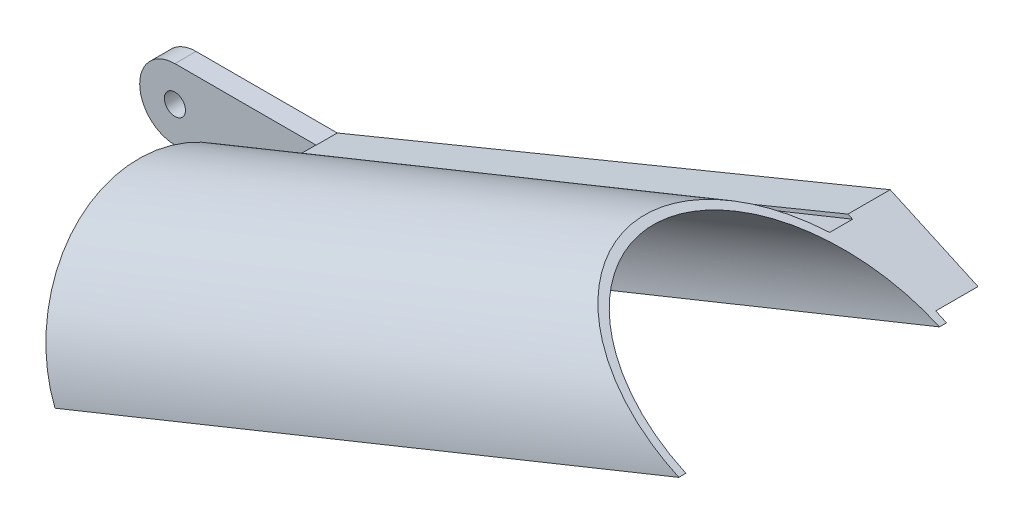
ISO-10303-21;
HEADER;
FILE_DESCRIPTION(('STEP AP214'),'2;1');
FILE_NAME('part.step','',(''),(''),'','','');
FILE_SCHEMA(('AUTOMOTIVE_DESIGN { 1 0 10303 214 1 1 1 1 }'));
ENDSEC;
DATA;
#1=APPLICATION_CONTEXT('core data for automotive mechanical design processes');
#2=APPLICATION_PROTOCOL_DEFINITION('international standard','automotive_design',2000,#1);
#3=PRODUCT_CONTEXT('',#1,'mechanical');
#4=PRODUCT('Part','Part','',(#3));
#5=PRODUCT_RELATED_PRODUCT_CATEGORY('part','',(#4));
#6=PRODUCT_DEFINITION_FORMATION('','',#4);
#7=PRODUCT_DEFINITION_CONTEXT('part definition',#1,'design');
#8=PRODUCT_DEFINITION('design','',#6,#7);
#9=PRODUCT_DEFINITION_SHAPE('','',#8);
#10=(LENGTH_UNIT() NAMED_UNIT(*) SI_UNIT(.MILLI.,.METRE.));
#11=(NAMED_UNIT(*) PLANE_ANGLE_UNIT() SI_UNIT($,.RADIAN.));
#12=(NAMED_UNIT(*) SI_UNIT($,.STERADIAN.) SOLID_ANGLE_UNIT());
#13=UNCERTAINTY_MEASURE_WITH_UNIT(LENGTH_MEASURE(1.E-05),#10,'distance_accuracy_value','');
#14=(GEOMETRIC_REPRESENTATION_CONTEXT(3) GLOBAL_UNCERTAINTY_ASSIGNED_CONTEXT((#13)) GLOBAL_UNIT_ASSIGNED_CONTEXT((#10,
#11,#12)) REPRESENTATION_CONTEXT('',''));
#15=CARTESIAN_POINT('',(0.,0.,0.));
#16=DIRECTION('',(0.,0.,1.));
#17=DIRECTION('',(1.,0.,0.));
#18=AXIS2_PLACEMENT_3D('',#15,#16,#17);
#19=CARTESIAN_POINT('',(4.9396925444234,-12.0143404155981,3.));
#20=DIRECTION('',(0.380263412733207,-0.924878228166549,0.));
#21=DIRECTION('',(0.924878228166549,0.380263412733207,0.));
#22=AXIS2_PLACEMENT_3D('',#19,#20,#21);
#23=PLANE('',#22);
#24=DIRECTION('',(-0.924878228166549,-0.380263412733207,0.));
#25=VECTOR('',#24,1.);
#26=CARTESIAN_POINT('',(4.9396925444234,-12.0143404155981,0.));
#27=LINE('',#26,#25);
#28=CARTESIAN_POINT('',(111.008388468843,31.595772859895,0.));
#29=VERTEX_POINT('',#28);
#30=CARTESIAN_POINT('',(22.,-5.,0.));
#31=VERTEX_POINT('',#30);
#32=EDGE_CURVE('E269',#29,#31,#27,.T.);
#33=ORIENTED_EDGE('',*,*,#32,.F.);
#34=DIRECTION('',(0.,0.,1.));
#35=VECTOR('',#34,1.);
#36=CARTESIAN_POINT('',(111.008388468843,31.595772859895,-70.0584015433783));
#37=LINE('',#36,#35);
#38=CARTESIAN_POINT('',(111.008388468843,31.595772859895,6.));
#39=VERTEX_POINT('',#38);
#40=EDGE_CURVE('E236',#29,#39,#37,.T.);
#41=ORIENTED_EDGE('',*,*,#40,.T.);
#42=DIRECTION('',(0.924878228166549,0.380263412733207,0.));
#43=VECTOR('',#42,1.);
#44=CARTESIAN_POINT('',(111.008388468843,31.595772859895,6.));
#45=LINE('',#44,#43);
#46=CARTESIAN_POINT('',(23.732077121253,-4.28785699869866,6.));
#47=VERTEX_POINT('',#46);
#48=EDGE_CURVE('E219',#47,#39,#45,.T.);
#49=ORIENTED_EDGE('',*,*,#48,.F.);
#50=DIRECTION('',(0.,0.,-1.));
#51=VECTOR('',#50,1.);
#52=CARTESIAN_POINT('',(23.732077121253,-4.28785699869866,6.));
#53=LINE('',#52,#51);
#54=CARTESIAN_POINT('',(23.732077121253,-4.28785699869868,3.));
#55=VERTEX_POINT('',#54);
#56=EDGE_CURVE('E221',#47,#55,#53,.T.);
#57=ORIENTED_EDGE('',*,*,#56,.T.);
#58=DIRECTION('',(-0.924878228166549,-0.380263412733207,0.));
#59=VECTOR('',#58,1.);
#60=CARTESIAN_POINT('',(4.9396925444234,-12.0143404155981,3.));
#61=LINE('',#60,#59);
#62=CARTESIAN_POINT('',(22.,-5.,3.));
#63=VERTEX_POINT('',#62);
#64=EDGE_CURVE('E252',#55,#63,#61,.T.);
#65=ORIENTED_EDGE('',*,*,#64,.T.);
#66=DIRECTION('',(0.,0.,-1.));
#67=VECTOR('',#66,1.);
#68=CARTESIAN_POINT('',(22.,-5.,3.));
#69=LINE('',#68,#67);
#70=EDGE_CURVE('E263',#63,#31,#69,.T.);
#71=ORIENTED_EDGE('',*,*,#70,.T.);
#72=EDGE_LOOP('',(#33,#41,#49,#57,#65,#71));
#73=FACE_BOUND('',#72,.T.);
#74=ADVANCED_FACE('F45',(#73),#23,.T.);
#75=CARTESIAN_POINT('',(1.14074851739701,-2.77453321099285,3.));
#76=DIRECTION('',(-0.380263412733207,0.924878228166549,0.));
#77=DIRECTION('',(-0.924878228166549,-0.380263412733207,0.));
#78=AXIS2_PLACEMENT_3D('',#75,#76,#77);
#79=PLANE('',#78);
#80=DIRECTION('',(0.924878228166549,0.380263412733207,0.));
#81=VECTOR('',#80,1.);
#82=CARTESIAN_POINT('',(1.14074851739701,-2.77453321099285,0.));
#83=LINE('',#82,#81);
#84=CARTESIAN_POINT('',(20.05,5.,0.));
#85=VERTEX_POINT('',#84);
#86=CARTESIAN_POINT('',(98.5445869727126,37.2730264528967,0.));
#87=VERTEX_POINT('',#86);
#88=EDGE_CURVE('E272',#85,#87,#83,.T.);
#89=ORIENTED_EDGE('',*,*,#88,.F.);
#90=DIRECTION('',(0.,0.,-1.));
#91=VECTOR('',#90,1.);
#92=CARTESIAN_POINT('',(20.05,5.,3.));
#93=LINE('',#92,#91);
#94=CARTESIAN_POINT('',(20.05,5.,3.));
#95=VERTEX_POINT('',#94);
#96=EDGE_CURVE('E49',#95,#85,#93,.T.);
#97=ORIENTED_EDGE('',*,*,#96,.F.);
#98=DIRECTION('',(-0.924878228166549,-0.380263412733207,0.));
#99=VECTOR('',#98,1.);
#100=CARTESIAN_POINT('',(98.5445869727126,37.2730264528967,3.));
#101=LINE('',#100,#99);
#102=CARTESIAN_POINT('',(19.9901871082395,4.97540794706412,3.));
#103=VERTEX_POINT('',#102);
#104=EDGE_CURVE('E11',#95,#103,#101,.T.);
#105=ORIENTED_EDGE('',*,*,#104,.T.);
#106=DIRECTION('',(0.,0.,-1.));
#107=VECTOR('',#106,1.);
#108=CARTESIAN_POINT('',(19.9901871082395,4.97540794706412,6.));
#109=LINE('',#108,#107);
#110=CARTESIAN_POINT('',(19.9901871082395,4.97540794706413,6.));
#111=VERTEX_POINT('',#110);
#112=EDGE_CURVE('E233',#111,#103,#109,.T.);
#113=ORIENTED_EDGE('',*,*,#112,.F.);
#114=DIRECTION('',(-0.924878228166549,-0.380263412733207,0.));
#115=VECTOR('',#114,1.);
#116=CARTESIAN_POINT('',(98.5445869727126,37.2730264528967,6.));
#117=LINE('',#116,#115);
#118=CARTESIAN_POINT('',(98.5445869727126,37.2730264528967,6.));
#119=VERTEX_POINT('',#118);
#120=EDGE_CURVE('E214',#119,#111,#117,.T.);
#121=ORIENTED_EDGE('',*,*,#120,.F.);
#122=DIRECTION('',(0.,0.,1.));
#123=VECTOR('',#122,1.);
#124=CARTESIAN_POINT('',(98.5445869727126,37.2730264528967,-70.0584015433783));
#125=LINE('',#124,#123);
#126=EDGE_CURVE('E237',#87,#119,#125,.T.);
#127=ORIENTED_EDGE('',*,*,#126,.F.);
#128=EDGE_LOOP('',(#89,#97,#105,#113,#121,#127));
#129=FACE_BOUND('',#128,.T.);
#130=ADVANCED_FACE('F297',(#129),#79,.T.);
#131=CARTESIAN_POINT('',(0.,5.,3.));
#132=DIRECTION('',(0.,1.,0.));
#133=DIRECTION('',(0.,0.,1.));
#134=AXIS2_PLACEMENT_3D('',#131,#132,#133);
#135=PLANE('',#134);
#136=DIRECTION('',(1.,0.,0.));
#137=VECTOR('',#136,1.);
#138=CARTESIAN_POINT('',(0.,5.,0.));
#139=LINE('',#138,#137);
#140=CARTESIAN_POINT('',(0.,5.,0.));
#141=VERTEX_POINT('',#140);
#142=EDGE_CURVE('E274',#141,#85,#139,.T.);
#143=ORIENTED_EDGE('',*,*,#142,.F.);
#144=DIRECTION('',(0.,0.,-1.));
#145=VECTOR('',#144,1.);
#146=CARTESIAN_POINT('',(0.,5.,3.));
#147=LINE('',#146,#145);
#148=CARTESIAN_POINT('',(0.,5.,3.));
#149=VERTEX_POINT('',#148);
#150=EDGE_CURVE('E285',#149,#141,#147,.T.);
#151=ORIENTED_EDGE('',*,*,#150,.F.);
#152=DIRECTION('',(1.,0.,0.));
#153=VECTOR('',#152,1.);
#154=CARTESIAN_POINT('',(0.,5.,3.));
#155=LINE('',#154,#153);
#156=EDGE_CURVE('E254',#149,#95,#155,.T.);
#157=ORIENTED_EDGE('',*,*,#156,.T.);
#158=ORIENTED_EDGE('',*,*,#96,.T.);
#159=EDGE_LOOP('',(#143,#151,#157,#158));
#160=FACE_BOUND('',#159,.T.);
#161=ADVANCED_FACE('F293',(#160),#135,.T.);
#162=CARTESIAN_POINT('',(0.,0.,3.));
#163=DIRECTION('',(0.,0.,-1.));
#164=DIRECTION('',(-1.,0.,0.));
#165=AXIS2_PLACEMENT_3D('',#162,#163,#164);
#166=CYLINDRICAL_SURFACE('',#165,5.);
#167=CARTESIAN_POINT('',(0.,0.,0.));
#168=DIRECTION('',(0.,0.,1.));
#169=DIRECTION('',(1.,0.,0.));
#170=AXIS2_PLACEMENT_3D('',#167,#168,#169);
#171=CIRCLE('',#170,5.);
#172=CARTESIAN_POINT('',(0.,-5.,0.));
#173=VERTEX_POINT('',#172);
#174=EDGE_CURVE('E277',#141,#173,#171,.T.);
#175=ORIENTED_EDGE('',*,*,#174,.T.);
#176=DIRECTION('',(0.,0.,-1.));
#177=VECTOR('',#176,1.);
#178=CARTESIAN_POINT('',(0.,-5.,3.));
#179=LINE('',#178,#177);
#180=CARTESIAN_POINT('',(0.,-5.,3.));
#181=VERTEX_POINT('',#180);
#182=EDGE_CURVE('E283',#181,#173,#179,.T.);
#183=ORIENTED_EDGE('',*,*,#182,.F.);
#184=CARTESIAN_POINT('',(0.,0.,3.));
#185=DIRECTION('',(0.,0.,1.));
#186=DIRECTION('',(1.,0.,0.));
#187=AXIS2_PLACEMENT_3D('',#184,#185,#186);
#188=CIRCLE('',#187,5.);
#189=EDGE_CURVE('E257',#149,#181,#188,.T.);
#190=ORIENTED_EDGE('',*,*,#189,.F.);
#191=ORIENTED_EDGE('',*,*,#150,.T.);
#192=EDGE_LOOP('',(#175,#183,#190,#191));
#193=FACE_BOUND('',#192,.T.);
#194=ADVANCED_FACE('F302',(#193),#166,.T.);
#195=CARTESIAN_POINT('',(0.,0.,3.));
#196=DIRECTION('',(0.,0.,-1.));
#197=DIRECTION('',(-1.,0.,0.));
#198=AXIS2_PLACEMENT_3D('',#195,#196,#197);
#199=CYLINDRICAL_SURFACE('',#198,1.5);
#200=CARTESIAN_POINT('',(0.,0.,3.));
#201=DIRECTION('',(0.,0.,1.));
#202=DIRECTION('',(1.,0.,0.));
#203=AXIS2_PLACEMENT_3D('',#200,#201,#202);
#204=CIRCLE('',#203,1.5);
#205=CARTESIAN_POINT('',(1.5,0.,3.));
#206=VERTEX_POINT('',#205);
#207=EDGE_CURVE('E248',#206,#206,#204,.T.);
#208=ORIENTED_EDGE('',*,*,#207,.T.);
#209=EDGE_LOOP('',(#208));
#210=FACE_BOUND('',#209,.T.);
#211=CARTESIAN_POINT('',(0.,0.,0.));
#212=DIRECTION('',(0.,0.,1.));
#213=DIRECTION('',(1.,0.,0.));
#214=AXIS2_PLACEMENT_3D('',#211,#212,#213);
#215=CIRCLE('',#214,1.5);
#216=CARTESIAN_POINT('',(1.5,0.,0.));
#217=VERTEX_POINT('',#216);
#218=EDGE_CURVE('E266',#217,#217,#215,.T.);
#219=ORIENTED_EDGE('',*,*,#218,.F.);
#220=EDGE_LOOP('',(#219));
#221=FACE_BOUND('',#220,.T.);
#222=ADVANCED_FACE('F352',(#210,#221),#199,.F.);
#223=CARTESIAN_POINT('',(22.,0.,3.));
#224=DIRECTION('',(0.,0.,-1.));
#225=DIRECTION('',(-1.,0.,0.));
#226=AXIS2_PLACEMENT_3D('',#223,#224,#225);
#227=CYLINDRICAL_SURFACE('',#226,1.5);
#228=CARTESIAN_POINT('',(22.,0.,3.));
#229=DIRECTION('',(0.,0.,1.));
#230=DIRECTION('',(1.,0.,0.));
#231=AXIS2_PLACEMENT_3D('',#228,#229,#230);
#232=CIRCLE('',#231,1.5);
#233=CARTESIAN_POINT('',(23.5,0.,3.));
#234=VERTEX_POINT('',#233);
#235=EDGE_CURVE('E245',#234,#234,#232,.T.);
#236=ORIENTED_EDGE('',*,*,#235,.T.);
#237=EDGE_LOOP('',(#236));
#238=FACE_BOUND('',#237,.T.);
#239=CARTESIAN_POINT('',(22.,0.,0.));
#240=DIRECTION('',(0.,0.,1.));
#241=DIRECTION('',(1.,0.,0.));
#242=AXIS2_PLACEMENT_3D('',#239,#240,#241);
#243=CIRCLE('',#242,1.5);
#244=CARTESIAN_POINT('',(23.5,0.,0.));
#245=VERTEX_POINT('',#244);
#246=EDGE_CURVE('E244',#245,#245,#243,.T.);
#247=ORIENTED_EDGE('',*,*,#246,.F.);
#248=EDGE_LOOP('',(#247));
#249=FACE_BOUND('',#248,.T.);
#250=ADVANCED_FACE('F47',(#238,#249),#227,.F.);
#251=CARTESIAN_POINT('',(0.,-5.,3.));
#252=DIRECTION('',(0.,1.,0.));
#253=DIRECTION('',(0.,0.,1.));
#254=AXIS2_PLACEMENT_3D('',#251,#252,#253);
#255=PLANE('',#254);
#256=DIRECTION('',(1.,0.,0.));
#257=VECTOR('',#256,1.);
#258=CARTESIAN_POINT('',(0.,-5.,0.));
#259=LINE('',#258,#257);
#260=EDGE_CURVE('E249',#173,#31,#259,.T.);
#261=ORIENTED_EDGE('',*,*,#260,.T.);
#262=ORIENTED_EDGE('',*,*,#70,.F.);
#263=DIRECTION('',(1.,0.,0.));
#264=VECTOR('',#263,1.);
#265=CARTESIAN_POINT('',(0.,-5.,3.));
#266=LINE('',#265,#264);
#267=EDGE_CURVE('E260',#181,#63,#266,.T.);
#268=ORIENTED_EDGE('',*,*,#267,.F.);
#269=ORIENTED_EDGE('',*,*,#182,.T.);
#270=EDGE_LOOP('',(#261,#262,#268,#269));
#271=FACE_BOUND('',#270,.T.);
#272=ADVANCED_FACE('F304',(#271),#255,.F.);
#273=CARTESIAN_POINT('',(0.,0.,3.));
#274=DIRECTION('',(0.,0.,1.));
#275=DIRECTION('',(1.,0.,0.));
#276=AXIS2_PLACEMENT_3D('',#273,#274,#275);
#277=PLANE('',#276);
#278=DIRECTION('',(0.374545329089981,-0.927208604606794,0.));
#279=VECTOR('',#278,1.);
#280=CARTESIAN_POINT('',(22.936363322725,-2.31802151151698,3.));
#281=LINE('',#280,#279);
#282=CARTESIAN_POINT('',(22.936363322725,-2.31802151151698,3.));
#283=VERTEX_POINT('',#282);
#284=EDGE_CURVE('E69',#283,#55,#281,.T.);
#285=ORIENTED_EDGE('',*,*,#284,.F.);
#286=CARTESIAN_POINT('',(22.,0.,3.));
#287=DIRECTION('',(0.,0.,-1.));
#288=DIRECTION('',(1.,0.,0.));
#289=AXIS2_PLACEMENT_3D('',#286,#287,#288);
#290=CIRCLE('',#289,2.5);
#291=CARTESIAN_POINT('',(21.063636677275,2.31802151151699,3.));
#292=VERTEX_POINT('',#291);
#293=EDGE_CURVE('E186',#292,#283,#290,.T.);
#294=ORIENTED_EDGE('',*,*,#293,.F.);
#295=DIRECTION('',(0.374545329089981,-0.927208604606794,0.));
#296=VECTOR('',#295,1.);
#297=CARTESIAN_POINT('',(19.9901871082395,4.97540794706412,3.));
#298=LINE('',#297,#296);
#299=EDGE_CURVE('E183',#103,#292,#298,.T.);
#300=ORIENTED_EDGE('',*,*,#299,.F.);
#301=ORIENTED_EDGE('',*,*,#104,.F.);
#302=ORIENTED_EDGE('',*,*,#156,.F.);
#303=ORIENTED_EDGE('',*,*,#189,.T.);
#304=ORIENTED_EDGE('',*,*,#267,.T.);
#305=ORIENTED_EDGE('',*,*,#64,.F.);
#306=EDGE_LOOP('',(#285,#294,#300,#301,#302,#303,#304,#305));
#307=FACE_BOUND('',#306,.T.);
#308=ORIENTED_EDGE('',*,*,#235,.F.);
#309=EDGE_LOOP('',(#308));
#310=FACE_BOUND('',#309,.T.);
#311=ORIENTED_EDGE('',*,*,#207,.F.);
#312=EDGE_LOOP('',(#311));
#313=FACE_BOUND('',#312,.T.);
#314=ADVANCED_FACE('F306',(#307,#310,#313),#277,.T.);
#315=CARTESIAN_POINT('',(0.,0.,0.));
#316=DIRECTION('',(0.,0.,1.));
#317=DIRECTION('',(1.,0.,0.));
#318=AXIS2_PLACEMENT_3D('',#315,#316,#317);
#319=PLANE('',#318);
#320=ORIENTED_EDGE('',*,*,#246,.T.);
#321=EDGE_LOOP('',(#320));
#322=FACE_BOUND('',#321,.T.);
#323=ORIENTED_EDGE('',*,*,#218,.T.);
#324=EDGE_LOOP('',(#323));
#325=FACE_BOUND('',#324,.T.);
#326=ORIENTED_EDGE('',*,*,#32,.T.);
#327=ORIENTED_EDGE('',*,*,#260,.F.);
#328=ORIENTED_EDGE('',*,*,#174,.F.);
#329=ORIENTED_EDGE('',*,*,#142,.T.);
#330=ORIENTED_EDGE('',*,*,#88,.T.);
#331=DIRECTION('',(0.910039172794664,-0.414522259932087,0.));
#332=VECTOR('',#331,1.);
#333=CARTESIAN_POINT('',(98.5445869727126,37.2730264528967,0.));
#334=LINE('',#333,#332);
#335=EDGE_CURVE('E240',#87,#29,#334,.T.);
#336=ORIENTED_EDGE('',*,*,#335,.T.);
#337=EDGE_LOOP('',(#326,#327,#328,#329,#330,#336));
#338=FACE_BOUND('',#337,.T.);
#339=ADVANCED_FACE('F300',(#322,#325,#338),#319,.F.);
#340=CARTESIAN_POINT('',(98.5445869727126,37.2730264528967,-70.0584015433783));
#341=DIRECTION('',(0.414522259932087,0.910039172794664,0.));
#342=DIRECTION('',(-0.910039172794664,0.414522259932087,0.));
#343=AXIS2_PLACEMENT_3D('',#340,#341,#342);
#344=PLANE('',#343);
#345=ORIENTED_EDGE('',*,*,#335,.F.);
#346=ORIENTED_EDGE('',*,*,#126,.T.);
#347=DIRECTION('',(-0.910039172794664,0.414522259932087,0.));
#348=VECTOR('',#347,1.);
#349=CARTESIAN_POINT('',(111.008388468843,31.595772859895,6.));
#350=LINE('',#349,#348);
#351=CARTESIAN_POINT('',(99.2027046390745,36.9732542776794,6.));
#352=VERTEX_POINT('',#351);
#353=EDGE_CURVE('E212',#352,#119,#350,.T.);
#354=ORIENTED_EDGE('',*,*,#353,.F.);
#355=DIRECTION('',(0.,0.,1.));
#356=VECTOR('',#355,1.);
#357=CARTESIAN_POINT('',(99.2027046390745,36.9732542776794,5.99999999999998));
#358=LINE('',#357,#356);
#359=CARTESIAN_POINT('',(99.2027046390745,36.9732542776794,9.24919284175386));
#360=VERTEX_POINT('',#359);
#361=EDGE_CURVE('E182',#352,#360,#358,.T.);
#362=ORIENTED_EDGE('',*,*,#361,.T.);
#363=CARTESIAN_POINT('',(112.537082770818,30.8994535851387,25.));
#364=DIRECTION('',(0.414522259932087,0.910039172794664,0.));
#365=DIRECTION('',(-0.910039172794664,0.414522259932087,0.));
#366=AXIS2_PLACEMENT_3D('',#363,#364,#365);
#367=ELLIPSE('',#366,26.1996861209567,19.);
#368=CARTESIAN_POINT('',(112.537082770818,30.8994535851386,44.));
#369=VERTEX_POINT('',#368);
#370=EDGE_CURVE('E160',#360,#369,#367,.T.);
#371=ORIENTED_EDGE('',*,*,#370,.T.);
#372=DIRECTION('',(-2.51845148096073E-13,1.14715303541412E-13,-1.));
#373=VECTOR('',#372,1.);
#374=CARTESIAN_POINT('',(112.537082770818,30.8994535851387,43.0000000000079));
#375=LINE('',#374,#373);
#376=CARTESIAN_POINT('',(112.537082770818,30.8994535851387,43.));
#377=VERTEX_POINT('',#376);
#378=EDGE_CURVE('E170',#369,#377,#375,.T.);
#379=ORIENTED_EDGE('',*,*,#378,.T.);
#380=CARTESIAN_POINT('',(112.537082770818,30.8994535851387,25.));
#381=DIRECTION('',(0.414522259932087,0.910039172794664,0.));
#382=DIRECTION('',(-0.910039172794664,0.414522259932087,0.));
#383=AXIS2_PLACEMENT_3D('',#380,#381,#382);
#384=ELLIPSE('',#383,24.8207552724853,18.);
#385=CARTESIAN_POINT('',(112.537082770818,30.8994535851387,7.));
#386=VERTEX_POINT('',#385);
#387=EDGE_CURVE('E176',#377,#386,#384,.F.);
#388=ORIENTED_EDGE('',*,*,#387,.T.);
#389=DIRECTION('',(0.,0.,-1.));
#390=VECTOR('',#389,1.);
#391=CARTESIAN_POINT('',(112.537082770818,30.8994535851387,6.00000000000013));
#392=LINE('',#391,#390);
#393=CARTESIAN_POINT('',(112.537082770818,30.8994535851387,6.));
#394=VERTEX_POINT('',#393);
#395=EDGE_CURVE('E196',#386,#394,#392,.T.);
#396=ORIENTED_EDGE('',*,*,#395,.T.);
#397=DIRECTION('',(-0.910039172794664,0.414522259932087,0.));
#398=VECTOR('',#397,1.);
#399=CARTESIAN_POINT('',(131.537549265576,22.2447532748392,6.));
#400=LINE('',#399,#398);
#401=EDGE_CURVE('E188',#394,#39,#400,.T.);
#402=ORIENTED_EDGE('',*,*,#401,.T.);
#403=ORIENTED_EDGE('',*,*,#40,.F.);
#404=EDGE_LOOP('',(#345,#346,#354,#362,#371,#379,#388,#396,#402,#403));
#405=FACE_BOUND('',#404,.T.);
#406=ADVANCED_FACE('F180',(#405),#344,.T.);
#407=CARTESIAN_POINT('',(19.9901871082395,4.97540794706412,6.));
#408=DIRECTION('',(0.927208604606794,0.374545329089981,0.));
#409=DIRECTION('',(-0.374545329089981,0.927208604606794,0.));
#410=AXIS2_PLACEMENT_3D('',#407,#408,#409);
#411=PLANE('',#410);
#412=ORIENTED_EDGE('',*,*,#299,.T.);
#413=DIRECTION('',(0.,0.,-1.));
#414=VECTOR('',#413,1.);
#415=CARTESIAN_POINT('',(21.063636677275,2.31802151151699,6.));
#416=LINE('',#415,#414);
#417=CARTESIAN_POINT('',(21.063636677275,2.31802151151699,6.));
#418=VERTEX_POINT('',#417);
#419=EDGE_CURVE('E230',#418,#292,#416,.T.);
#420=ORIENTED_EDGE('',*,*,#419,.F.);
#421=DIRECTION('',(-0.37454532908998,0.927208604606794,0.));
#422=VECTOR('',#421,1.);
#423=CARTESIAN_POINT('',(19.9901871082395,4.97540794706413,6.));
#424=LINE('',#423,#422);
#425=CARTESIAN_POINT('',(22.936363322725,-2.31802151151698,6.));
#426=VERTEX_POINT('',#425);
#427=EDGE_CURVE('E205',#426,#418,#424,.T.);
#428=ORIENTED_EDGE('',*,*,#427,.F.);
#429=DIRECTION('',(0.,0.,-1.));
#430=VECTOR('',#429,1.);
#431=CARTESIAN_POINT('',(22.936363322725,-2.31802151151698,6.));
#432=LINE('',#431,#430);
#433=EDGE_CURVE('E227',#426,#283,#432,.T.);
#434=ORIENTED_EDGE('',*,*,#433,.T.);
#435=ORIENTED_EDGE('',*,*,#284,.T.);
#436=ORIENTED_EDGE('',*,*,#56,.F.);
#437=CARTESIAN_POINT('',(23.9701092622994,-4.87711931812855,6.));
#438=VERTEX_POINT('',#437);
#439=EDGE_CURVE('E208',#438,#47,#424,.T.);
#440=ORIENTED_EDGE('',*,*,#439,.F.);
#441=DIRECTION('',(0.,0.,-1.));
#442=VECTOR('',#441,1.);
#443=CARTESIAN_POINT('',(23.9701092622994,-4.87711931812855,6.));
#444=LINE('',#443,#442);
#445=CARTESIAN_POINT('',(23.9701092622994,-4.87711931812855,7.));
#446=VERTEX_POINT('',#445);
#447=EDGE_CURVE('E202',#446,#438,#444,.T.);
#448=ORIENTED_EDGE('',*,*,#447,.F.);
#449=CARTESIAN_POINT('',(23.9701092622994,-4.87711931812855,25.));
#450=DIRECTION('',(-0.927208604606794,-0.37454532908998,0.));
#451=DIRECTION('',(-0.37454532908998,0.927208604606794,0.));
#452=AXIS2_PLACEMENT_3D('',#449,#450,#451);
#453=CIRCLE('',#452,18.);
#454=CARTESIAN_POINT('',(23.9701092622994,-4.87711931812855,43.));
#455=VERTEX_POINT('',#454);
#456=EDGE_CURVE('E191',#455,#446,#453,.T.);
#457=ORIENTED_EDGE('',*,*,#456,.F.);
#458=DIRECTION('',(0.,1.85615411929517E-13,-1.));
#459=VECTOR('',#458,1.);
#460=CARTESIAN_POINT('',(23.9701092622994,-4.87711931812855,43.));
#461=LINE('',#460,#459);
#462=CARTESIAN_POINT('',(23.9701092622995,-4.87711931812874,44.));
#463=VERTEX_POINT('',#462);
#464=EDGE_CURVE('E167',#463,#455,#461,.T.);
#465=ORIENTED_EDGE('',*,*,#464,.F.);
#466=CARTESIAN_POINT('',(23.9701092622994,-4.87711931812855,25.));
#467=DIRECTION('',(0.927208604606794,0.37454532908998,0.));
#468=DIRECTION('',(-0.37454532908998,0.927208604606794,0.));
#469=AXIS2_PLACEMENT_3D('',#466,#467,#468);
#470=CIRCLE('',#469,19.);
#471=CARTESIAN_POINT('',(19.9901871082395,4.97540794706413,9.24919284175386));
#472=VERTEX_POINT('',#471);
#473=EDGE_CURVE('E163',#472,#463,#470,.T.);
#474=ORIENTED_EDGE('',*,*,#473,.F.);
#475=DIRECTION('',(0.,0.,1.));
#476=VECTOR('',#475,1.);
#477=CARTESIAN_POINT('',(19.9901871082395,4.97540794706413,6.));
#478=LINE('',#477,#476);
#479=EDGE_CURVE('E207',#111,#472,#478,.T.);
#480=ORIENTED_EDGE('',*,*,#479,.F.);
#481=ORIENTED_EDGE('',*,*,#112,.T.);
#482=EDGE_LOOP('',(#412,#420,#428,#434,#435,#436,#440,#448,#457,#465,#474,#480,#481));
#483=FACE_BOUND('',#482,.T.);
#484=ADVANCED_FACE('F310',(#483),#411,.F.);
#485=CARTESIAN_POINT('',(22.,0.,6.));
#486=DIRECTION('',(0.,0.,-1.));
#487=DIRECTION('',(-1.,0.,0.));
#488=AXIS2_PLACEMENT_3D('',#485,#486,#487);
#489=CYLINDRICAL_SURFACE('',#488,2.5);
#490=ORIENTED_EDGE('',*,*,#293,.T.);
#491=ORIENTED_EDGE('',*,*,#433,.F.);
#492=CARTESIAN_POINT('',(22.,0.,6.));
#493=DIRECTION('',(0.,0.,-1.));
#494=DIRECTION('',(1.,0.,0.));
#495=AXIS2_PLACEMENT_3D('',#492,#493,#494);
#496=CIRCLE('',#495,2.5);
#497=EDGE_CURVE('E216',#418,#426,#496,.T.);
#498=ORIENTED_EDGE('',*,*,#497,.F.);
#499=ORIENTED_EDGE('',*,*,#419,.T.);
#500=EDGE_LOOP('',(#490,#491,#498,#499));
#501=FACE_BOUND('',#500,.T.);
#502=ADVANCED_FACE('F441',(#501),#489,.F.);
#503=CARTESIAN_POINT('',(22.,0.,6.));
#504=DIRECTION('',(0.,0.,1.));
#505=DIRECTION('',(1.,0.,0.));
#506=AXIS2_PLACEMENT_3D('',#503,#504,#505);
#507=PLANE('',#506);
#508=DIRECTION('',(-0.927208604606794,-0.37454532908998,0.));
#509=VECTOR('',#508,1.);
#510=CARTESIAN_POINT('',(147.050258722126,56.3012434714241,6.));
#511=LINE('',#510,#509);
#512=EDGE_CURVE('E61',#352,#111,#511,.T.);
#513=ORIENTED_EDGE('',*,*,#512,.F.);
#514=ORIENTED_EDGE('',*,*,#353,.T.);
#515=ORIENTED_EDGE('',*,*,#120,.T.);
#516=EDGE_LOOP('',(#513,#514,#515));
#517=FACE_BOUND('',#516,.T.);
#518=ADVANCED_FACE('F451',(#517),#507,.T.);
#519=CARTESIAN_POINT('',(147.050258722126,56.3012434714241,6.));
#520=DIRECTION('',(0.,0.,1.));
#521=DIRECTION('',(1.,0.,0.));
#522=AXIS2_PLACEMENT_3D('',#519,#520,#521);
#523=PLANE('',#522);
#524=ORIENTED_EDGE('',*,*,#427,.T.);
#525=ORIENTED_EDGE('',*,*,#497,.T.);
#526=EDGE_LOOP('',(#524,#525));
#527=FACE_BOUND('',#526,.T.);
#528=ADVANCED_FACE('F341',(#527),#523,.F.);
#529=ORIENTED_EDGE('',*,*,#439,.T.);
#530=ORIENTED_EDGE('',*,*,#48,.T.);
#531=ORIENTED_EDGE('',*,*,#401,.F.);
#532=DIRECTION('',(-0.927208604606794,-0.37454532908998,0.));
#533=VECTOR('',#532,1.);
#534=CARTESIAN_POINT('',(151.030180876186,46.4487162062314,6.));
#535=LINE('',#534,#533);
#536=EDGE_CURVE('E203',#394,#438,#535,.T.);
#537=ORIENTED_EDGE('',*,*,#536,.T.);
#538=EDGE_LOOP('',(#529,#530,#531,#537));
#539=FACE_BOUND('',#538,.T.);
#540=ADVANCED_FACE('F329',(#539),#523,.F.);
#541=CARTESIAN_POINT('',(151.030180876186,46.4487162062314,25.));
#542=DIRECTION('',(-0.927208604606794,-0.37454532908998,0.));
#543=DIRECTION('',(0.37454532908998,-0.927208604606794,0.));
#544=AXIS2_PLACEMENT_3D('',#541,#542,#543);
#545=CYLINDRICAL_SURFACE('',#544,18.);
#546=ORIENTED_EDGE('',*,*,#387,.F.);
#547=DIRECTION('',(-0.927208604606794,-0.37454532908998,0.));
#548=VECTOR('',#547,1.);
#549=CARTESIAN_POINT('',(151.030180876186,46.4487162062314,43.));
#550=LINE('',#549,#548);
#551=EDGE_CURVE('E172',#377,#455,#550,.T.);
#552=ORIENTED_EDGE('',*,*,#551,.T.);
#553=ORIENTED_EDGE('',*,*,#456,.T.);
#554=DIRECTION('',(-0.927208604606794,-0.37454532908998,0.));
#555=VECTOR('',#554,1.);
#556=CARTESIAN_POINT('',(151.030180876186,46.4487162062314,7.));
#557=LINE('',#556,#555);
#558=EDGE_CURVE('E200',#386,#446,#557,.T.);
#559=ORIENTED_EDGE('',*,*,#558,.F.);
#560=EDGE_LOOP('',(#546,#552,#553,#559));
#561=FACE_BOUND('',#560,.T.);
#562=ADVANCED_FACE('F332',(#561),#545,.F.);
#563=CARTESIAN_POINT('',(151.030180876186,46.4487162062314,6.));
#564=DIRECTION('',(-0.37454532908998,0.927208604606794,0.));
#565=DIRECTION('',(-0.927208604606794,-0.37454532908998,0.));
#566=AXIS2_PLACEMENT_3D('',#563,#564,#565);
#567=PLANE('',#566);
#568=ORIENTED_EDGE('',*,*,#395,.F.);
#569=ORIENTED_EDGE('',*,*,#558,.T.);
#570=ORIENTED_EDGE('',*,*,#447,.T.);
#571=ORIENTED_EDGE('',*,*,#536,.F.);
#572=EDGE_LOOP('',(#568,#569,#570,#571));
#573=FACE_BOUND('',#572,.T.);
#574=ADVANCED_FACE('F323',(#573),#567,.F.);
#575=CARTESIAN_POINT('',(147.050258722126,56.3012434714241,6.));
#576=DIRECTION('',(0.37454532908998,-0.927208604606794,0.));
#577=DIRECTION('',(0.927208604606794,0.37454532908998,0.));
#578=AXIS2_PLACEMENT_3D('',#575,#576,#577);
#579=PLANE('',#578);
#580=ORIENTED_EDGE('',*,*,#361,.F.);
#581=ORIENTED_EDGE('',*,*,#512,.T.);
#582=ORIENTED_EDGE('',*,*,#479,.T.);
#583=DIRECTION('',(-0.927208604606794,-0.37454532908998,0.));
#584=VECTOR('',#583,1.);
#585=CARTESIAN_POINT('',(147.050258722126,56.3012434714241,9.24919284175386));
#586=LINE('',#585,#584);
#587=EDGE_CURVE('E209',#360,#472,#586,.T.);
#588=ORIENTED_EDGE('',*,*,#587,.F.);
#589=EDGE_LOOP('',(#580,#581,#582,#588));
#590=FACE_BOUND('',#589,.T.);
#591=ADVANCED_FACE('F339',(#590),#579,.F.);
#592=CARTESIAN_POINT('',(151.030180876186,46.4487162062314,25.));
#593=DIRECTION('',(-0.927208604606794,-0.37454532908998,0.));
#594=DIRECTION('',(0.37454532908998,-0.927208604606794,0.));
#595=AXIS2_PLACEMENT_3D('',#592,#593,#594);
#596=CYLINDRICAL_SURFACE('',#595,19.);
#597=ORIENTED_EDGE('',*,*,#370,.F.);
#598=ORIENTED_EDGE('',*,*,#587,.T.);
#599=ORIENTED_EDGE('',*,*,#473,.T.);
#600=DIRECTION('',(-0.927208604606794,-0.37454532908998,0.));
#601=VECTOR('',#600,1.);
#602=CARTESIAN_POINT('',(151.030180876186,46.4487162062312,44.));
#603=LINE('',#602,#601);
#604=EDGE_CURVE('E156',#369,#463,#603,.T.);
#605=ORIENTED_EDGE('',*,*,#604,.F.);
#606=EDGE_LOOP('',(#597,#598,#599,#605));
#607=FACE_BOUND('',#606,.T.);
#608=ADVANCED_FACE('F158',(#607),#596,.T.);
#609=CARTESIAN_POINT('',(151.030180876186,46.4487162062314,43.));
#610=DIRECTION('',(-0.37454532908998,0.927208604606794,2.00692440397036E-13));
#611=DIRECTION('',(-0.927208604606794,-0.37454532908998,0.));
#612=AXIS2_PLACEMENT_3D('',#609,#610,#611);
#613=PLANE('',#612);
#614=ORIENTED_EDGE('',*,*,#378,.F.);
#615=ORIENTED_EDGE('',*,*,#604,.T.);
#616=ORIENTED_EDGE('',*,*,#464,.T.);
#617=ORIENTED_EDGE('',*,*,#551,.F.);
#618=EDGE_LOOP('',(#614,#615,#616,#617));
#619=FACE_BOUND('',#618,.T.);
#620=ADVANCED_FACE('F171',(#619),#613,.F.);
#621=CLOSED_SHELL('',(#74,#130,#161,#194,#222,#250,#272,#314,#339,#406,#484,#502,#518,#528,#540,
#562,#574,#591,#608,#620));
#622=MANIFOLD_SOLID_BREP('B2',#621);
#623=ADVANCED_BREP_SHAPE_REPRESENTATION('',(#18,#622),#14);
#624=SHAPE_DEFINITION_REPRESENTATION(#9,#623);
ENDSEC;
END-ISO-10303-21;
